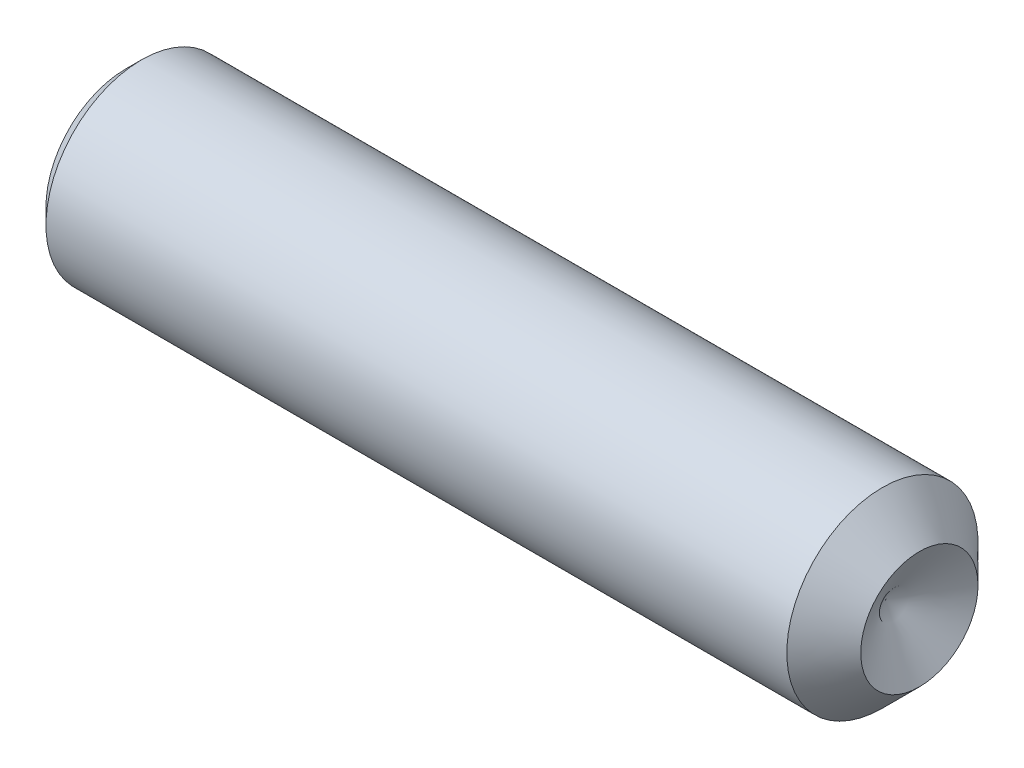
ISO-10303-21;
HEADER;
FILE_DESCRIPTION(('STEP AP214'),'2;1');
FILE_NAME('part.step','',(''),(''),'','','');
FILE_SCHEMA(('AUTOMOTIVE_DESIGN { 1 0 10303 214 1 1 1 1 }'));
ENDSEC;
DATA;
#1=APPLICATION_CONTEXT('core data for automotive mechanical design processes');
#2=APPLICATION_PROTOCOL_DEFINITION('international standard','automotive_design',2000,#1);
#3=PRODUCT_CONTEXT('',#1,'mechanical');
#4=PRODUCT('Part','Part','',(#3));
#5=PRODUCT_RELATED_PRODUCT_CATEGORY('part','',(#4));
#6=PRODUCT_DEFINITION_FORMATION('','',#4);
#7=PRODUCT_DEFINITION_CONTEXT('part definition',#1,'design');
#8=PRODUCT_DEFINITION('design','',#6,#7);
#9=PRODUCT_DEFINITION_SHAPE('','',#8);
#10=(LENGTH_UNIT() NAMED_UNIT(*) SI_UNIT(.MILLI.,.METRE.));
#11=(NAMED_UNIT(*) PLANE_ANGLE_UNIT() SI_UNIT($,.RADIAN.));
#12=(NAMED_UNIT(*) SI_UNIT($,.STERADIAN.) SOLID_ANGLE_UNIT());
#13=UNCERTAINTY_MEASURE_WITH_UNIT(LENGTH_MEASURE(1.E-05),#10,'distance_accuracy_value','');
#14=(GEOMETRIC_REPRESENTATION_CONTEXT(3) GLOBAL_UNCERTAINTY_ASSIGNED_CONTEXT((#13)) GLOBAL_UNIT_ASSIGNED_CONTEXT((#10,
#11,#12)) REPRESENTATION_CONTEXT('',''));
#15=CARTESIAN_POINT('',(0.,0.,0.));
#16=DIRECTION('',(0.,0.,1.));
#17=DIRECTION('',(1.,0.,0.));
#18=AXIS2_PLACEMENT_3D('',#15,#16,#17);
#19=CARTESIAN_POINT('',(0.,0.,0.));
#20=DIRECTION('',(1.,0.,0.));
#21=DIRECTION('',(0.,1.,0.));
#22=AXIS2_PLACEMENT_3D('',#19,#20,#21);
#23=PLANE('',#22);
#24=CARTESIAN_POINT('',(0.,0.,0.));
#25=DIRECTION('',(1.,0.,0.));
#26=DIRECTION('',(0.,1.,0.));
#27=AXIS2_PLACEMENT_3D('',#24,#25,#26);
#28=CIRCLE('',#27,2.5);
#29=CARTESIAN_POINT('',(0.,2.5,0.));
#30=VERTEX_POINT('',#29);
#31=EDGE_CURVE('E150',#30,#30,#28,.F.);
#32=ORIENTED_EDGE('',*,*,#31,.T.);
#33=EDGE_LOOP('',(#32));
#34=FACE_BOUND('',#33,.T.);
#35=DIRECTION('',(0.,-0.5,-0.866025403784439));
#36=VECTOR('',#35,1.);
#37=CARTESIAN_POINT('',(0.,1.73205080756888,0.));
#38=LINE('',#37,#36);
#39=CARTESIAN_POINT('',(0.,1.73205080756888,0.));
#40=VERTEX_POINT('',#39);
#41=CARTESIAN_POINT('',(0.,0.866025403784439,-1.5));
#42=VERTEX_POINT('',#41);
#43=EDGE_CURVE('E266',#40,#42,#38,.T.);
#44=ORIENTED_EDGE('',*,*,#43,.F.);
#45=DIRECTION('',(0.,0.5,-0.866025403784439));
#46=VECTOR('',#45,1.);
#47=CARTESIAN_POINT('',(0.,0.866025403784439,1.5));
#48=LINE('',#47,#46);
#49=CARTESIAN_POINT('',(0.,0.866025403784439,1.5));
#50=VERTEX_POINT('',#49);
#51=EDGE_CURVE('E49',#50,#40,#48,.T.);
#52=ORIENTED_EDGE('',*,*,#51,.F.);
#53=DIRECTION('',(0.,1.,0.));
#54=VECTOR('',#53,1.);
#55=CARTESIAN_POINT('',(0.,-0.866025403784439,1.5));
#56=LINE('',#55,#54);
#57=CARTESIAN_POINT('',(0.,-0.866025403784439,1.5));
#58=VERTEX_POINT('',#57);
#59=EDGE_CURVE('E254',#58,#50,#56,.T.);
#60=ORIENTED_EDGE('',*,*,#59,.F.);
#61=DIRECTION('',(0.,0.5,0.866025403784439));
#62=VECTOR('',#61,1.);
#63=CARTESIAN_POINT('',(0.,-1.73205080756888,0.));
#64=LINE('',#63,#62);
#65=CARTESIAN_POINT('',(0.,-1.73205080756888,0.));
#66=VERTEX_POINT('',#65);
#67=EDGE_CURVE('E257',#66,#58,#64,.T.);
#68=ORIENTED_EDGE('',*,*,#67,.F.);
#69=DIRECTION('',(0.,-0.5,0.866025403784438));
#70=VECTOR('',#69,1.);
#71=CARTESIAN_POINT('',(0.,-0.866025403784439,-1.5));
#72=LINE('',#71,#70);
#73=CARTESIAN_POINT('',(0.,-0.866025403784439,-1.5));
#74=VERTEX_POINT('',#73);
#75=EDGE_CURVE('E260',#74,#66,#72,.T.);
#76=ORIENTED_EDGE('',*,*,#75,.F.);
#77=DIRECTION('',(0.,-1.,0.));
#78=VECTOR('',#77,1.);
#79=CARTESIAN_POINT('',(0.,0.866025403784439,-1.5));
#80=LINE('',#79,#78);
#81=EDGE_CURVE('E263',#42,#74,#80,.T.);
#82=ORIENTED_EDGE('',*,*,#81,.F.);
#83=EDGE_LOOP('',(#44,#52,#60,#68,#76,#82));
#84=FACE_BOUND('',#83,.T.);
#85=ADVANCED_FACE('F34',(#34,#84),#23,.F.);
#86=CARTESIAN_POINT('',(25.,0.,0.));
#87=DIRECTION('',(-1.,0.,0.));
#88=DIRECTION('',(0.,-1.,0.));
#89=AXIS2_PLACEMENT_3D('',#86,#87,#88);
#90=CYLINDRICAL_SURFACE('',#89,3.);
#91=CARTESIAN_POINT('',(23.75,0.,0.));
#92=DIRECTION('',(-1.,0.,0.));
#93=DIRECTION('',(0.,-1.,0.));
#94=AXIS2_PLACEMENT_3D('',#91,#92,#93);
#95=CIRCLE('',#94,3.);
#96=CARTESIAN_POINT('',(23.75,-3.,0.));
#97=VERTEX_POINT('',#96);
#98=EDGE_CURVE('E42',#97,#97,#95,.T.);
#99=ORIENTED_EDGE('',*,*,#98,.T.);
#100=EDGE_LOOP('',(#99));
#101=FACE_BOUND('',#100,.T.);
#102=CARTESIAN_POINT('',(0.5,0.,0.));
#103=DIRECTION('',(1.,0.,0.));
#104=DIRECTION('',(0.,1.,0.));
#105=AXIS2_PLACEMENT_3D('',#102,#103,#104);
#106=CIRCLE('',#105,3.);
#107=CARTESIAN_POINT('',(0.5,3.,0.));
#108=VERTEX_POINT('',#107);
#109=EDGE_CURVE('E153',#108,#108,#106,.T.);
#110=ORIENTED_EDGE('',*,*,#109,.T.);
#111=EDGE_LOOP('',(#110));
#112=FACE_BOUND('',#111,.T.);
#113=ADVANCED_FACE('F104',(#101,#112),#90,.T.);
#114=CARTESIAN_POINT('',(2.,1.73205080756888,0.));
#115=DIRECTION('',(-1.,0.,0.));
#116=DIRECTION('',(0.,0.,1.));
#117=AXIS2_PLACEMENT_3D('',#114,#115,#116);
#118=PLANE('',#117);
#119=DIRECTION('',(0.,0.5,-0.866025403784439));
#120=VECTOR('',#119,1.);
#121=CARTESIAN_POINT('',(2.,0.866025403784439,1.5));
#122=LINE('',#121,#120);
#123=CARTESIAN_POINT('',(2.,0.866025403784439,1.5));
#124=VERTEX_POINT('',#123);
#125=CARTESIAN_POINT('',(2.,1.73205080756888,0.));
#126=VERTEX_POINT('',#125);
#127=EDGE_CURVE('E146',#124,#126,#122,.T.);
#128=ORIENTED_EDGE('',*,*,#127,.T.);
#129=DIRECTION('',(0.,-0.5,-0.866025403784439));
#130=VECTOR('',#129,1.);
#131=CARTESIAN_POINT('',(2.,1.73205080756888,0.));
#132=LINE('',#131,#130);
#133=CARTESIAN_POINT('',(2.,0.866025403784439,-1.5));
#134=VERTEX_POINT('',#133);
#135=EDGE_CURVE('E280',#126,#134,#132,.T.);
#136=ORIENTED_EDGE('',*,*,#135,.T.);
#137=DIRECTION('',(0.,-1.,0.));
#138=VECTOR('',#137,1.);
#139=CARTESIAN_POINT('',(2.,0.866025403784439,-1.5));
#140=LINE('',#139,#138);
#141=CARTESIAN_POINT('',(2.,-0.866025403784439,-1.5));
#142=VERTEX_POINT('',#141);
#143=EDGE_CURVE('E277',#134,#142,#140,.T.);
#144=ORIENTED_EDGE('',*,*,#143,.T.);
#145=DIRECTION('',(0.,-0.5,0.866025403784438));
#146=VECTOR('',#145,1.);
#147=CARTESIAN_POINT('',(2.,-0.866025403784439,-1.5));
#148=LINE('',#147,#146);
#149=CARTESIAN_POINT('',(2.,-1.73205080756888,0.));
#150=VERTEX_POINT('',#149);
#151=EDGE_CURVE('E274',#142,#150,#148,.T.);
#152=ORIENTED_EDGE('',*,*,#151,.T.);
#153=DIRECTION('',(0.,0.5,0.866025403784439));
#154=VECTOR('',#153,1.);
#155=CARTESIAN_POINT('',(2.,-1.73205080756888,0.));
#156=LINE('',#155,#154);
#157=CARTESIAN_POINT('',(2.,-0.866025403784439,1.5));
#158=VERTEX_POINT('',#157);
#159=EDGE_CURVE('E271',#150,#158,#156,.T.);
#160=ORIENTED_EDGE('',*,*,#159,.T.);
#161=DIRECTION('',(0.,1.,0.));
#162=VECTOR('',#161,1.);
#163=CARTESIAN_POINT('',(2.,-0.866025403784439,1.5));
#164=LINE('',#163,#162);
#165=EDGE_CURVE('E247',#158,#124,#164,.T.);
#166=ORIENTED_EDGE('',*,*,#165,.T.);
#167=EDGE_LOOP('',(#128,#136,#144,#152,#160,#166));
#168=FACE_BOUND('',#167,.T.);
#169=CARTESIAN_POINT('',(2.,0.,0.));
#170=DIRECTION('',(-1.,0.,0.));
#171=DIRECTION('',(0.,0.,1.));
#172=AXIS2_PLACEMENT_3D('',#169,#170,#171);
#173=CIRCLE('',#172,1.495);
#174=CARTESIAN_POINT('',(2.,0.,1.495));
#175=VERTEX_POINT('',#174);
#176=EDGE_CURVE('E149',#175,#175,#173,.F.);
#177=ORIENTED_EDGE('',*,*,#176,.T.);
#178=EDGE_LOOP('',(#177));
#179=FACE_BOUND('',#178,.T.);
#180=ADVANCED_FACE('F110',(#168,#179),#118,.T.);
#181=CARTESIAN_POINT('',(2.,0.866025403784439,1.5));
#182=DIRECTION('',(0.,0.866025403784439,0.5));
#183=DIRECTION('',(0.,-0.5,0.866025403784439));
#184=AXIS2_PLACEMENT_3D('',#181,#182,#183);
#185=PLANE('',#184);
#186=ORIENTED_EDGE('',*,*,#51,.T.);
#187=DIRECTION('',(-1.,0.,0.));
#188=VECTOR('',#187,1.);
#189=CARTESIAN_POINT('',(2.,1.73205080756888,0.));
#190=LINE('',#189,#188);
#191=EDGE_CURVE('E158',#126,#40,#190,.T.);
#192=ORIENTED_EDGE('',*,*,#191,.F.);
#193=ORIENTED_EDGE('',*,*,#127,.F.);
#194=DIRECTION('',(-1.,0.,0.));
#195=VECTOR('',#194,1.);
#196=CARTESIAN_POINT('',(2.,0.866025403784439,1.5));
#197=LINE('',#196,#195);
#198=EDGE_CURVE('E151',#124,#50,#197,.T.);
#199=ORIENTED_EDGE('',*,*,#198,.T.);
#200=EDGE_LOOP('',(#186,#192,#193,#199));
#201=FACE_BOUND('',#200,.T.);
#202=ADVANCED_FACE('F116',(#201),#185,.F.);
#203=CARTESIAN_POINT('',(2.,-0.866025403784439,1.5));
#204=DIRECTION('',(0.,0.,1.));
#205=DIRECTION('',(0.,-1.,0.));
#206=AXIS2_PLACEMENT_3D('',#203,#204,#205);
#207=PLANE('',#206);
#208=ORIENTED_EDGE('',*,*,#59,.T.);
#209=ORIENTED_EDGE('',*,*,#198,.F.);
#210=ORIENTED_EDGE('',*,*,#165,.F.);
#211=DIRECTION('',(-1.,0.,0.));
#212=VECTOR('',#211,1.);
#213=CARTESIAN_POINT('',(2.,-0.866025403784439,1.5));
#214=LINE('',#213,#212);
#215=EDGE_CURVE('E155',#158,#58,#214,.T.);
#216=ORIENTED_EDGE('',*,*,#215,.T.);
#217=EDGE_LOOP('',(#208,#209,#210,#216));
#218=FACE_BOUND('',#217,.T.);
#219=ADVANCED_FACE('F119',(#218),#207,.F.);
#220=CARTESIAN_POINT('',(2.,-1.73205080756888,0.));
#221=DIRECTION('',(0.,-0.866025403784439,0.5));
#222=DIRECTION('',(0.,-0.5,-0.866025403784439));
#223=AXIS2_PLACEMENT_3D('',#220,#221,#222);
#224=PLANE('',#223);
#225=ORIENTED_EDGE('',*,*,#67,.T.);
#226=ORIENTED_EDGE('',*,*,#215,.F.);
#227=ORIENTED_EDGE('',*,*,#159,.F.);
#228=DIRECTION('',(-1.,0.,0.));
#229=VECTOR('',#228,1.);
#230=CARTESIAN_POINT('',(2.,-1.73205080756888,0.));
#231=LINE('',#230,#229);
#232=EDGE_CURVE('E251',#150,#66,#231,.T.);
#233=ORIENTED_EDGE('',*,*,#232,.T.);
#234=EDGE_LOOP('',(#225,#226,#227,#233));
#235=FACE_BOUND('',#234,.T.);
#236=ADVANCED_FACE('F130',(#235),#224,.F.);
#237=CARTESIAN_POINT('',(2.,-0.866025403784439,-1.5));
#238=DIRECTION('',(0.,-0.866025403784439,-0.5));
#239=DIRECTION('',(0.,0.5,-0.866025403784438));
#240=AXIS2_PLACEMENT_3D('',#237,#238,#239);
#241=PLANE('',#240);
#242=ORIENTED_EDGE('',*,*,#75,.T.);
#243=ORIENTED_EDGE('',*,*,#232,.F.);
#244=ORIENTED_EDGE('',*,*,#151,.F.);
#245=DIRECTION('',(-1.,0.,0.));
#246=VECTOR('',#245,1.);
#247=CARTESIAN_POINT('',(2.,-0.866025403784439,-1.5));
#248=LINE('',#247,#246);
#249=EDGE_CURVE('E249',#142,#74,#248,.T.);
#250=ORIENTED_EDGE('',*,*,#249,.T.);
#251=EDGE_LOOP('',(#242,#243,#244,#250));
#252=FACE_BOUND('',#251,.T.);
#253=ADVANCED_FACE('F126',(#252),#241,.F.);
#254=CARTESIAN_POINT('',(2.,0.866025403784439,-1.5));
#255=DIRECTION('',(0.,0.,-1.));
#256=DIRECTION('',(-1.,0.,0.));
#257=AXIS2_PLACEMENT_3D('',#254,#255,#256);
#258=PLANE('',#257);
#259=ORIENTED_EDGE('',*,*,#81,.T.);
#260=ORIENTED_EDGE('',*,*,#249,.F.);
#261=ORIENTED_EDGE('',*,*,#143,.F.);
#262=DIRECTION('',(-1.,0.,0.));
#263=VECTOR('',#262,1.);
#264=CARTESIAN_POINT('',(2.,0.866025403784439,-1.5));
#265=LINE('',#264,#263);
#266=EDGE_CURVE('E246',#134,#42,#265,.T.);
#267=ORIENTED_EDGE('',*,*,#266,.T.);
#268=EDGE_LOOP('',(#259,#260,#261,#267));
#269=FACE_BOUND('',#268,.T.);
#270=ADVANCED_FACE('F122',(#269),#258,.F.);
#271=CARTESIAN_POINT('',(2.,1.73205080756888,0.));
#272=DIRECTION('',(0.,0.866025403784439,-0.5));
#273=DIRECTION('',(0.,0.5,0.866025403784439));
#274=AXIS2_PLACEMENT_3D('',#271,#272,#273);
#275=PLANE('',#274);
#276=ORIENTED_EDGE('',*,*,#43,.T.);
#277=ORIENTED_EDGE('',*,*,#266,.F.);
#278=ORIENTED_EDGE('',*,*,#135,.F.);
#279=ORIENTED_EDGE('',*,*,#191,.T.);
#280=EDGE_LOOP('',(#276,#277,#278,#279));
#281=FACE_BOUND('',#280,.T.);
#282=ADVANCED_FACE('F99',(#281),#275,.F.);
#283=CARTESIAN_POINT('',(2.86313865243849,0.,0.));
#284=DIRECTION('',(-1.,0.,0.));
#285=DIRECTION('',(0.,0.,1.));
#286=AXIS2_PLACEMENT_3D('',#283,#284,#285);
#287=CONICAL_SURFACE('',#286,0.,1.0471975511966);
#288=ORIENTED_EDGE('',*,*,#176,.F.);
#289=EDGE_LOOP('',(#288));
#290=FACE_BOUND('',#289,.T.);
#291=CARTESIAN_POINT('',(2.86313865243849,0.,0.));
#292=VERTEX_POINT('',#291);
#293=VERTEX_LOOP('',#292);
#294=FACE_BOUND('',#293,.T.);
#295=ADVANCED_FACE('F91',(#290,#294),#287,.F.);
#296=CARTESIAN_POINT('',(25.,0.,0.));
#297=DIRECTION('',(1.,0.,0.));
#298=DIRECTION('',(0.,0.,-1.));
#299=AXIS2_PLACEMENT_3D('',#296,#297,#298);
#300=CONICAL_SURFACE('',#299,1.995,1.04719755119659);
#301=CARTESIAN_POINT('',(24.9103237760728,0.,0.));
#302=DIRECTION('',(-1.,0.,0.));
#303=DIRECTION('',(0.,-1.,0.));
#304=AXIS2_PLACEMENT_3D('',#301,#302,#303);
#305=CIRCLE('',#304,1.83967622392718);
#306=CARTESIAN_POINT('',(24.9103237760728,-1.83967622392718,0.));
#307=VERTEX_POINT('',#306);
#308=EDGE_CURVE('E11',#307,#307,#305,.F.);
#309=ORIENTED_EDGE('',*,*,#308,.T.);
#310=EDGE_LOOP('',(#309));
#311=FACE_BOUND('',#310,.T.);
#312=CARTESIAN_POINT('',(23.8481862129667,0.,0.));
#313=VERTEX_POINT('',#312);
#314=VERTEX_LOOP('',#313);
#315=FACE_BOUND('',#314,.T.);
#316=ADVANCED_FACE('F88',(#311,#315),#300,.F.);
#317=CARTESIAN_POINT('',(0.,0.,0.));
#318=DIRECTION('',(1.,0.,0.));
#319=DIRECTION('',(0.,1.,0.));
#320=AXIS2_PLACEMENT_3D('',#317,#318,#319);
#321=CONICAL_SURFACE('',#320,2.5,0.785398163397447);
#322=ORIENTED_EDGE('',*,*,#109,.F.);
#323=EDGE_LOOP('',(#322));
#324=FACE_BOUND('',#323,.T.);
#325=ORIENTED_EDGE('',*,*,#31,.F.);
#326=EDGE_LOOP('',(#325));
#327=FACE_BOUND('',#326,.T.);
#328=ADVANCED_FACE('F90',(#324,#327),#321,.T.);
#329=CARTESIAN_POINT('',(23.75,0.,0.));
#330=DIRECTION('',(-1.,0.,0.));
#331=DIRECTION('',(0.,-1.,0.));
#332=AXIS2_PLACEMENT_3D('',#329,#330,#331);
#333=CONICAL_SURFACE('',#332,3.,0.785398163397443);
#334=ORIENTED_EDGE('',*,*,#308,.F.);
#335=EDGE_LOOP('',(#334));
#336=FACE_BOUND('',#335,.T.);
#337=ORIENTED_EDGE('',*,*,#98,.F.);
#338=EDGE_LOOP('',(#337));
#339=FACE_BOUND('',#338,.T.);
#340=ADVANCED_FACE('F36',(#336,#339),#333,.T.);
#341=CLOSED_SHELL('',(#85,#113,#180,#202,#219,#236,#253,#270,#282,#295,#316,#328,#340));
#342=MANIFOLD_SOLID_BREP('B2',#341);
#343=ADVANCED_BREP_SHAPE_REPRESENTATION('',(#18,#342),#14);
#344=SHAPE_DEFINITION_REPRESENTATION(#9,#343);
ENDSEC;
END-ISO-10303-21;
